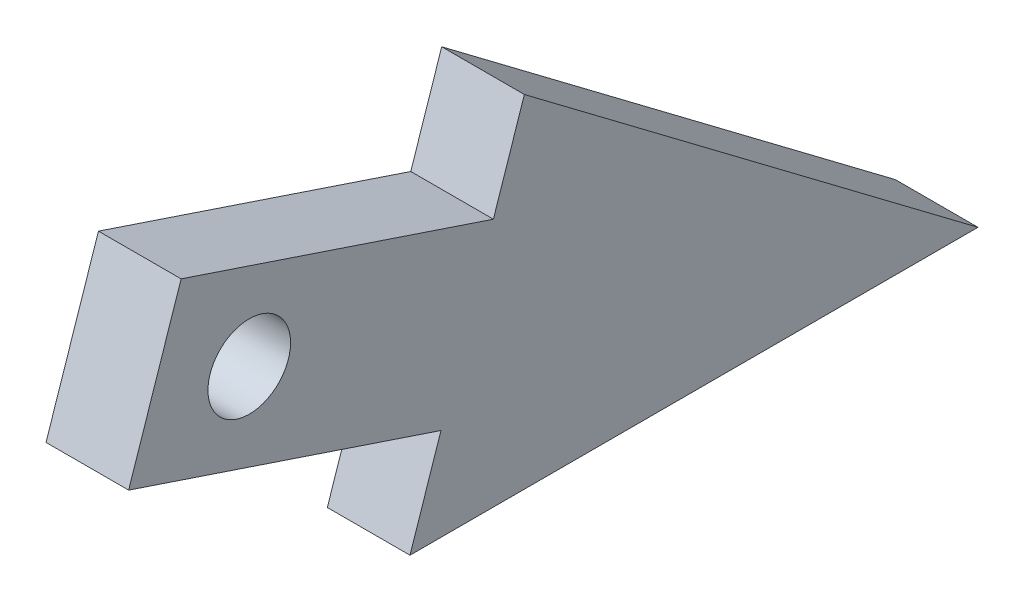
ISO-10303-21;
HEADER;
FILE_DESCRIPTION(('STEP AP214'),'2;1');
FILE_NAME('part.step','',(''),(''),'','','');
FILE_SCHEMA(('AUTOMOTIVE_DESIGN { 1 0 10303 214 1 1 1 1 }'));
ENDSEC;
DATA;
#1=APPLICATION_CONTEXT('core data for automotive mechanical design processes');
#2=APPLICATION_PROTOCOL_DEFINITION('international standard','automotive_design',2000,#1);
#3=PRODUCT_CONTEXT('',#1,'mechanical');
#4=PRODUCT('Part','Part','',(#3));
#5=PRODUCT_RELATED_PRODUCT_CATEGORY('part','',(#4));
#6=PRODUCT_DEFINITION_FORMATION('','',#4);
#7=PRODUCT_DEFINITION_CONTEXT('part definition',#1,'design');
#8=PRODUCT_DEFINITION('design','',#6,#7);
#9=PRODUCT_DEFINITION_SHAPE('','',#8);
#10=(LENGTH_UNIT() NAMED_UNIT(*) SI_UNIT(.MILLI.,.METRE.));
#11=(NAMED_UNIT(*) PLANE_ANGLE_UNIT() SI_UNIT($,.RADIAN.));
#12=(NAMED_UNIT(*) SI_UNIT($,.STERADIAN.) SOLID_ANGLE_UNIT());
#13=UNCERTAINTY_MEASURE_WITH_UNIT(LENGTH_MEASURE(1.E-05),#10,'distance_accuracy_value','');
#14=(GEOMETRIC_REPRESENTATION_CONTEXT(3) GLOBAL_UNCERTAINTY_ASSIGNED_CONTEXT((#13)) GLOBAL_UNIT_ASSIGNED_CONTEXT((#10,
#11,#12)) REPRESENTATION_CONTEXT('',''));
#15=CARTESIAN_POINT('',(0.,0.,0.));
#16=DIRECTION('',(0.,0.,1.));
#17=DIRECTION('',(1.,0.,0.));
#18=AXIS2_PLACEMENT_3D('',#15,#16,#17);
#19=CARTESIAN_POINT('',(25.4,0.,0.));
#20=DIRECTION('',(1.,0.,0.));
#21=DIRECTION('',(0.,0.,-1.));
#22=AXIS2_PLACEMENT_3D('',#19,#20,#21);
#23=PLANE('',#22);
#24=DIRECTION('',(0.,0.601815023152049,0.798635510047292));
#25=VECTOR('',#24,1.);
#26=CARTESIAN_POINT('',(25.4,0.,-223.942164258325));
#27=LINE('',#26,#25);
#28=CARTESIAN_POINT('',(25.4,0.,-223.942164258325));
#29=VERTEX_POINT('',#28);
#30=CARTESIAN_POINT('',(25.4,105.047442187551,-84.5395000788666));
#31=VERTEX_POINT('',#30);
#32=EDGE_CURVE('E141',#29,#31,#27,.T.);
#33=ORIENTED_EDGE('',*,*,#32,.T.);
#34=DIRECTION('',(0.,-0.948323655206199,0.317304656405093));
#35=VECTOR('',#34,1.);
#36=CARTESIAN_POINT('',(25.4,105.047442187551,-84.5395000788666));
#37=LINE('',#36,#35);
#38=CARTESIAN_POINT('',(25.4,76.611141936013,-75.0248471107465));
#39=VERTEX_POINT('',#38);
#40=EDGE_CURVE('E94',#31,#39,#37,.T.);
#41=ORIENTED_EDGE('',*,*,#40,.T.);
#42=DIRECTION('',(0.,0.317304656405089,0.9483236552062));
#43=VECTOR('',#42,1.);
#44=CARTESIAN_POINT('',(25.4,108.72142857565,20.9426837185019));
#45=LINE('',#44,#43);
#46=CARTESIAN_POINT('',(25.4,108.72142857565,20.9426837185019));
#47=VERTEX_POINT('',#46);
#48=EDGE_CURVE('E153',#39,#47,#45,.T.);
#49=ORIENTED_EDGE('',*,*,#48,.T.);
#50=DIRECTION('',(0.,-0.948323655206199,0.317304656405093));
#51=VECTOR('',#50,1.);
#52=CARTESIAN_POINT('',(25.4,60.5465868911753,37.0617602638805));
#53=LINE('',#52,#51);
#54=CARTESIAN_POINT('',(25.4,60.5465868911753,37.0617602638805));
#55=VERTEX_POINT('',#54);
#56=EDGE_CURVE('E110',#47,#55,#53,.T.);
#57=ORIENTED_EDGE('',*,*,#56,.T.);
#58=DIRECTION('',(0.,-0.317304656405096,-0.948323655206198));
#59=VECTOR('',#58,1.);
#60=CARTESIAN_POINT('',(25.4,60.5465868911753,37.0617602638805));
#61=LINE('',#60,#59);
#62=CARTESIAN_POINT('',(25.4,28.4363002515375,-58.9057705653676));
#63=VERTEX_POINT('',#62);
#64=EDGE_CURVE('E104',#55,#63,#61,.T.);
#65=ORIENTED_EDGE('',*,*,#64,.T.);
#66=DIRECTION('',(0.,-0.948323655206199,0.317304656405093));
#67=VECTOR('',#66,1.);
#68=CARTESIAN_POINT('',(25.4,0.,-49.3911175972475));
#69=LINE('',#68,#67);
#70=CARTESIAN_POINT('',(25.4,0.,-49.3911175972475));
#71=VERTEX_POINT('',#70);
#72=EDGE_CURVE('E108',#63,#71,#69,.T.);
#73=ORIENTED_EDGE('',*,*,#72,.T.);
#74=DIRECTION('',(0.,0.,-1.));
#75=VECTOR('',#74,1.);
#76=CARTESIAN_POINT('',(25.4,0.,-223.942164258325));
#77=LINE('',#76,#75);
#78=EDGE_CURVE('E54',#71,#29,#77,.T.);
#79=ORIENTED_EDGE('',*,*,#78,.T.);
#80=EDGE_LOOP('',(#33,#41,#49,#57,#65,#73,#79));
#81=FACE_BOUND('',#80,.T.);
#82=CARTESIAN_POINT('',(25.4,74.93,0.));
#83=DIRECTION('',(1.,0.,0.));
#84=DIRECTION('',(0.,0.,-1.));
#85=AXIS2_PLACEMENT_3D('',#82,#83,#84);
#86=CIRCLE('',#85,12.7);
#87=CARTESIAN_POINT('',(25.4,74.93,-12.7));
#88=VERTEX_POINT('',#87);
#89=EDGE_CURVE('E132',#88,#88,#86,.T.);
#90=ORIENTED_EDGE('',*,*,#89,.F.);
#91=EDGE_LOOP('',(#90));
#92=FACE_BOUND('',#91,.T.);
#93=ADVANCED_FACE('F37',(#81,#92),#23,.T.);
#94=CARTESIAN_POINT('',(0.,0.,0.));
#95=DIRECTION('',(1.,0.,0.));
#96=DIRECTION('',(0.,0.,-1.));
#97=AXIS2_PLACEMENT_3D('',#94,#95,#96);
#98=PLANE('',#97);
#99=DIRECTION('',(0.,0.601815023152049,0.798635510047292));
#100=VECTOR('',#99,1.);
#101=CARTESIAN_POINT('',(0.,0.,-223.942164258325));
#102=LINE('',#101,#100);
#103=CARTESIAN_POINT('',(0.,0.,-223.942164258325));
#104=VERTEX_POINT('',#103);
#105=CARTESIAN_POINT('',(0.,105.047442187551,-84.5395000788666));
#106=VERTEX_POINT('',#105);
#107=EDGE_CURVE('E128',#104,#106,#102,.T.);
#108=ORIENTED_EDGE('',*,*,#107,.F.);
#109=DIRECTION('',(0.,0.,-1.));
#110=VECTOR('',#109,1.);
#111=CARTESIAN_POINT('',(0.,0.,-223.942164258325));
#112=LINE('',#111,#110);
#113=CARTESIAN_POINT('',(0.,0.,-49.3911175972475));
#114=VERTEX_POINT('',#113);
#115=EDGE_CURVE('E86',#114,#104,#112,.T.);
#116=ORIENTED_EDGE('',*,*,#115,.F.);
#117=DIRECTION('',(0.,-0.948323655206199,0.317304656405093));
#118=VECTOR('',#117,1.);
#119=CARTESIAN_POINT('',(0.,0.,-49.3911175972475));
#120=LINE('',#119,#118);
#121=CARTESIAN_POINT('',(0.,28.4363002515375,-58.9057705653676));
#122=VERTEX_POINT('',#121);
#123=EDGE_CURVE('E80',#122,#114,#120,.T.);
#124=ORIENTED_EDGE('',*,*,#123,.F.);
#125=DIRECTION('',(0.,-0.317304656405096,-0.948323655206198));
#126=VECTOR('',#125,1.);
#127=CARTESIAN_POINT('',(0.,60.5465868911753,37.0617602638805));
#128=LINE('',#127,#126);
#129=CARTESIAN_POINT('',(0.,60.5465868911753,37.0617602638805));
#130=VERTEX_POINT('',#129);
#131=EDGE_CURVE('E118',#130,#122,#128,.T.);
#132=ORIENTED_EDGE('',*,*,#131,.F.);
#133=DIRECTION('',(0.,-0.948323655206199,0.317304656405093));
#134=VECTOR('',#133,1.);
#135=CARTESIAN_POINT('',(0.,60.5465868911753,37.0617602638805));
#136=LINE('',#135,#134);
#137=CARTESIAN_POINT('',(0.,108.72142857565,20.9426837185019));
#138=VERTEX_POINT('',#137);
#139=EDGE_CURVE('E136',#138,#130,#136,.T.);
#140=ORIENTED_EDGE('',*,*,#139,.F.);
#141=DIRECTION('',(0.,0.317304656405089,0.9483236552062));
#142=VECTOR('',#141,1.);
#143=CARTESIAN_POINT('',(0.,108.72142857565,20.9426837185019));
#144=LINE('',#143,#142);
#145=CARTESIAN_POINT('',(0.,76.611141936013,-75.0248471107465));
#146=VERTEX_POINT('',#145);
#147=EDGE_CURVE('E134',#146,#138,#144,.T.);
#148=ORIENTED_EDGE('',*,*,#147,.F.);
#149=DIRECTION('',(0.,-0.948323655206199,0.317304656405093));
#150=VECTOR('',#149,1.);
#151=CARTESIAN_POINT('',(0.,105.047442187551,-84.5395000788666));
#152=LINE('',#151,#150);
#153=EDGE_CURVE('E131',#106,#146,#152,.T.);
#154=ORIENTED_EDGE('',*,*,#153,.F.);
#155=EDGE_LOOP('',(#108,#116,#124,#132,#140,#148,#154));
#156=FACE_BOUND('',#155,.T.);
#157=CARTESIAN_POINT('',(0.,74.93,0.));
#158=DIRECTION('',(1.,0.,0.));
#159=DIRECTION('',(0.,0.,-1.));
#160=AXIS2_PLACEMENT_3D('',#157,#158,#159);
#161=CIRCLE('',#160,12.7);
#162=CARTESIAN_POINT('',(0.,74.93,-12.7));
#163=VERTEX_POINT('',#162);
#164=EDGE_CURVE('E165',#163,#163,#161,.T.);
#165=ORIENTED_EDGE('',*,*,#164,.T.);
#166=EDGE_LOOP('',(#165));
#167=FACE_BOUND('',#166,.T.);
#168=ADVANCED_FACE('F157',(#156,#167),#98,.F.);
#169=CARTESIAN_POINT('',(25.4,0.,-223.942164258325));
#170=DIRECTION('',(0.,-0.798635510047292,0.601815023152049));
#171=DIRECTION('',(0.,-0.601815023152049,-0.798635510047292));
#172=AXIS2_PLACEMENT_3D('',#169,#170,#171);
#173=PLANE('',#172);
#174=ORIENTED_EDGE('',*,*,#107,.T.);
#175=DIRECTION('',(-1.,0.,0.));
#176=VECTOR('',#175,1.);
#177=CARTESIAN_POINT('',(25.4,105.047442187551,-84.5395000788666));
#178=LINE('',#177,#176);
#179=EDGE_CURVE('E11',#31,#106,#178,.T.);
#180=ORIENTED_EDGE('',*,*,#179,.F.);
#181=ORIENTED_EDGE('',*,*,#32,.F.);
#182=DIRECTION('',(-1.,0.,0.));
#183=VECTOR('',#182,1.);
#184=CARTESIAN_POINT('',(25.4,0.,-223.942164258325));
#185=LINE('',#184,#183);
#186=EDGE_CURVE('E124',#29,#104,#185,.T.);
#187=ORIENTED_EDGE('',*,*,#186,.T.);
#188=EDGE_LOOP('',(#174,#180,#181,#187));
#189=FACE_BOUND('',#188,.T.);
#190=ADVANCED_FACE('F39',(#189),#173,.F.);
#191=CARTESIAN_POINT('',(25.4,105.047442187551,-84.5395000788666));
#192=DIRECTION('',(0.,-0.317304656405093,-0.948323655206199));
#193=DIRECTION('',(0.,0.948323655206199,-0.317304656405093));
#194=AXIS2_PLACEMENT_3D('',#191,#192,#193);
#195=PLANE('',#194);
#196=ORIENTED_EDGE('',*,*,#153,.T.);
#197=DIRECTION('',(-1.,0.,0.));
#198=VECTOR('',#197,1.);
#199=CARTESIAN_POINT('',(25.4,76.611141936013,-75.0248471107465));
#200=LINE('',#199,#198);
#201=EDGE_CURVE('E46',#39,#146,#200,.T.);
#202=ORIENTED_EDGE('',*,*,#201,.F.);
#203=ORIENTED_EDGE('',*,*,#40,.F.);
#204=ORIENTED_EDGE('',*,*,#179,.T.);
#205=EDGE_LOOP('',(#196,#202,#203,#204));
#206=FACE_BOUND('',#205,.T.);
#207=ADVANCED_FACE('F191',(#206),#195,.F.);
#208=CARTESIAN_POINT('',(25.4,108.72142857565,20.9426837185019));
#209=DIRECTION('',(0.,-0.9483236552062,0.317304656405089));
#210=DIRECTION('',(0.,-0.317304656405089,-0.9483236552062));
#211=AXIS2_PLACEMENT_3D('',#208,#209,#210);
#212=PLANE('',#211);
#213=ORIENTED_EDGE('',*,*,#147,.T.);
#214=DIRECTION('',(-1.,0.,0.));
#215=VECTOR('',#214,1.);
#216=CARTESIAN_POINT('',(25.4,108.72142857565,20.9426837185019));
#217=LINE('',#216,#215);
#218=EDGE_CURVE('E145',#47,#138,#217,.T.);
#219=ORIENTED_EDGE('',*,*,#218,.F.);
#220=ORIENTED_EDGE('',*,*,#48,.F.);
#221=ORIENTED_EDGE('',*,*,#201,.T.);
#222=EDGE_LOOP('',(#213,#219,#220,#221));
#223=FACE_BOUND('',#222,.T.);
#224=ADVANCED_FACE('F151',(#223),#212,.F.);
#225=CARTESIAN_POINT('',(25.4,60.5465868911753,37.0617602638805));
#226=DIRECTION('',(0.,-0.317304656405093,-0.948323655206199));
#227=DIRECTION('',(0.,0.948323655206199,-0.317304656405093));
#228=AXIS2_PLACEMENT_3D('',#225,#226,#227);
#229=PLANE('',#228);
#230=ORIENTED_EDGE('',*,*,#139,.T.);
#231=DIRECTION('',(-1.,0.,0.));
#232=VECTOR('',#231,1.);
#233=CARTESIAN_POINT('',(25.4,60.5465868911753,37.0617602638805));
#234=LINE('',#233,#232);
#235=EDGE_CURVE('E119',#55,#130,#234,.T.);
#236=ORIENTED_EDGE('',*,*,#235,.F.);
#237=ORIENTED_EDGE('',*,*,#56,.F.);
#238=ORIENTED_EDGE('',*,*,#218,.T.);
#239=EDGE_LOOP('',(#230,#236,#237,#238));
#240=FACE_BOUND('',#239,.T.);
#241=ADVANCED_FACE('F160',(#240),#229,.F.);
#242=CARTESIAN_POINT('',(25.4,60.5465868911753,37.0617602638805));
#243=DIRECTION('',(0.,0.948323655206198,-0.317304656405096));
#244=DIRECTION('',(0.,0.317304656405096,0.948323655206198));
#245=AXIS2_PLACEMENT_3D('',#242,#243,#244);
#246=PLANE('',#245);
#247=ORIENTED_EDGE('',*,*,#131,.T.);
#248=DIRECTION('',(-1.,0.,0.));
#249=VECTOR('',#248,1.);
#250=CARTESIAN_POINT('',(25.4,28.4363002515375,-58.9057705653676));
#251=LINE('',#250,#249);
#252=EDGE_CURVE('E115',#63,#122,#251,.T.);
#253=ORIENTED_EDGE('',*,*,#252,.F.);
#254=ORIENTED_EDGE('',*,*,#64,.F.);
#255=ORIENTED_EDGE('',*,*,#235,.T.);
#256=EDGE_LOOP('',(#247,#253,#254,#255));
#257=FACE_BOUND('',#256,.T.);
#258=ADVANCED_FACE('F116',(#257),#246,.F.);
#259=CARTESIAN_POINT('',(25.4,0.,-49.3911175972475));
#260=DIRECTION('',(0.,-0.317304656405093,-0.948323655206199));
#261=DIRECTION('',(0.,0.948323655206199,-0.317304656405093));
#262=AXIS2_PLACEMENT_3D('',#259,#260,#261);
#263=PLANE('',#262);
#264=ORIENTED_EDGE('',*,*,#123,.T.);
#265=DIRECTION('',(-1.,0.,0.));
#266=VECTOR('',#265,1.);
#267=CARTESIAN_POINT('',(25.4,0.,-49.3911175972475));
#268=LINE('',#267,#266);
#269=EDGE_CURVE('E120',#71,#114,#268,.T.);
#270=ORIENTED_EDGE('',*,*,#269,.F.);
#271=ORIENTED_EDGE('',*,*,#72,.F.);
#272=ORIENTED_EDGE('',*,*,#252,.T.);
#273=EDGE_LOOP('',(#264,#270,#271,#272));
#274=FACE_BOUND('',#273,.T.);
#275=ADVANCED_FACE('F122',(#274),#263,.F.);
#276=CARTESIAN_POINT('',(25.4,0.,-223.942164258325));
#277=DIRECTION('',(0.,1.,0.));
#278=DIRECTION('',(0.,0.,1.));
#279=AXIS2_PLACEMENT_3D('',#276,#277,#278);
#280=PLANE('',#279);
#281=ORIENTED_EDGE('',*,*,#115,.T.);
#282=ORIENTED_EDGE('',*,*,#186,.F.);
#283=ORIENTED_EDGE('',*,*,#78,.F.);
#284=ORIENTED_EDGE('',*,*,#269,.T.);
#285=EDGE_LOOP('',(#281,#282,#283,#284));
#286=FACE_BOUND('',#285,.T.);
#287=ADVANCED_FACE('F181',(#286),#280,.F.);
#288=CARTESIAN_POINT('',(25.4,74.93,0.));
#289=DIRECTION('',(-1.,0.,0.));
#290=DIRECTION('',(0.,0.,1.));
#291=AXIS2_PLACEMENT_3D('',#288,#289,#290);
#292=CYLINDRICAL_SURFACE('',#291,12.7);
#293=ORIENTED_EDGE('',*,*,#89,.T.);
#294=EDGE_LOOP('',(#293));
#295=FACE_BOUND('',#294,.T.);
#296=ORIENTED_EDGE('',*,*,#164,.F.);
#297=EDGE_LOOP('',(#296));
#298=FACE_BOUND('',#297,.T.);
#299=ADVANCED_FACE('F171',(#295,#298),#292,.F.);
#300=CLOSED_SHELL('',(#93,#168,#190,#207,#224,#241,#258,#275,#287,#299));
#301=MANIFOLD_SOLID_BREP('B2',#300);
#302=ADVANCED_BREP_SHAPE_REPRESENTATION('',(#18,#301),#14);
#303=SHAPE_DEFINITION_REPRESENTATION(#9,#302);
ENDSEC;
END-ISO-10303-21;
